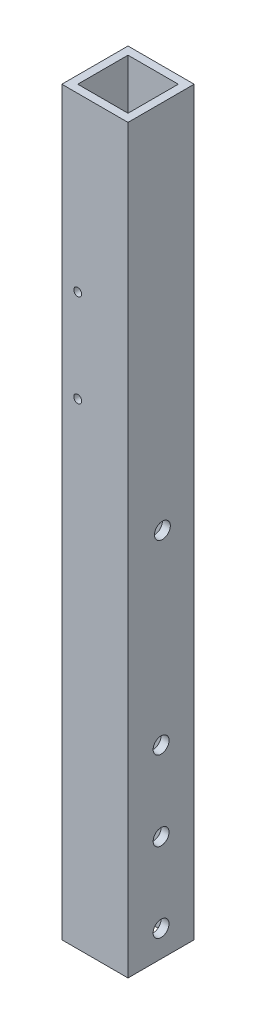
ISO-10303-21;
HEADER;
FILE_DESCRIPTION(('STEP AP214'),'2;1');
FILE_NAME('part.step','',(''),(''),'','','');
FILE_SCHEMA(('AUTOMOTIVE_DESIGN { 1 0 10303 214 1 1 1 1 }'));
ENDSEC;
DATA;
#1=APPLICATION_CONTEXT('core data for automotive mechanical design processes');
#2=APPLICATION_PROTOCOL_DEFINITION('international standard','automotive_design',2000,#1);
#3=PRODUCT_CONTEXT('',#1,'mechanical');
#4=PRODUCT('Part','Part','',(#3));
#5=PRODUCT_RELATED_PRODUCT_CATEGORY('part','',(#4));
#6=PRODUCT_DEFINITION_FORMATION('','',#4);
#7=PRODUCT_DEFINITION_CONTEXT('part definition',#1,'design');
#8=PRODUCT_DEFINITION('design','',#6,#7);
#9=PRODUCT_DEFINITION_SHAPE('','',#8);
#10=(LENGTH_UNIT() NAMED_UNIT(*) SI_UNIT(.MILLI.,.METRE.));
#11=(NAMED_UNIT(*) PLANE_ANGLE_UNIT() SI_UNIT($,.RADIAN.));
#12=(NAMED_UNIT(*) SI_UNIT($,.STERADIAN.) SOLID_ANGLE_UNIT());
#13=UNCERTAINTY_MEASURE_WITH_UNIT(LENGTH_MEASURE(1.E-05),#10,'distance_accuracy_value','');
#14=(GEOMETRIC_REPRESENTATION_CONTEXT(3) GLOBAL_UNCERTAINTY_ASSIGNED_CONTEXT((#13)) GLOBAL_UNIT_ASSIGNED_CONTEXT((#10,
#11,#12)) REPRESENTATION_CONTEXT('',''));
#15=CARTESIAN_POINT('',(0.,0.,0.));
#16=DIRECTION('',(0.,0.,1.));
#17=DIRECTION('',(1.,0.,0.));
#18=AXIS2_PLACEMENT_3D('',#15,#16,#17);
#19=CARTESIAN_POINT('',(0.,280.,0.));
#20=DIRECTION('',(0.,-1.,0.));
#21=DIRECTION('',(0.,0.,-1.));
#22=AXIS2_PLACEMENT_3D('',#19,#20,#21);
#23=PLANE('',#22);
#24=DIRECTION('',(0.,0.,1.));
#25=VECTOR('',#24,1.);
#26=CARTESIAN_POINT('',(0.,280.,0.));
#27=LINE('',#26,#25);
#28=CARTESIAN_POINT('',(0.,280.,-25.));
#29=VERTEX_POINT('',#28);
#30=CARTESIAN_POINT('',(0.,280.,0.));
#31=VERTEX_POINT('',#30);
#32=EDGE_CURVE('E140',#29,#31,#27,.T.);
#33=ORIENTED_EDGE('',*,*,#32,.T.);
#34=DIRECTION('',(1.,0.,0.));
#35=VECTOR('',#34,1.);
#36=CARTESIAN_POINT('',(0.,280.,0.));
#37=LINE('',#36,#35);
#38=CARTESIAN_POINT('',(25.,280.,0.));
#39=VERTEX_POINT('',#38);
#40=EDGE_CURVE('E143',#31,#39,#37,.T.);
#41=ORIENTED_EDGE('',*,*,#40,.T.);
#42=DIRECTION('',(0.,0.,-1.));
#43=VECTOR('',#42,1.);
#44=CARTESIAN_POINT('',(25.,280.,0.));
#45=LINE('',#44,#43);
#46=CARTESIAN_POINT('',(25.,280.,-25.));
#47=VERTEX_POINT('',#46);
#48=EDGE_CURVE('E146',#39,#47,#45,.T.);
#49=ORIENTED_EDGE('',*,*,#48,.T.);
#50=DIRECTION('',(-1.,0.,0.));
#51=VECTOR('',#50,1.);
#52=CARTESIAN_POINT('',(0.,280.,-25.));
#53=LINE('',#52,#51);
#54=EDGE_CURVE('E148',#47,#29,#53,.T.);
#55=ORIENTED_EDGE('',*,*,#54,.T.);
#56=EDGE_LOOP('',(#33,#41,#49,#55));
#57=FACE_BOUND('',#56,.T.);
#58=DIRECTION('',(0.,0.,1.));
#59=VECTOR('',#58,1.);
#60=CARTESIAN_POINT('',(3.,280.,-3.));
#61=LINE('',#60,#59);
#62=CARTESIAN_POINT('',(3.,280.,-22.));
#63=VERTEX_POINT('',#62);
#64=CARTESIAN_POINT('',(3.,280.,-3.));
#65=VERTEX_POINT('',#64);
#66=EDGE_CURVE('E102',#63,#65,#61,.T.);
#67=ORIENTED_EDGE('',*,*,#66,.F.);
#68=DIRECTION('',(-1.,0.,0.));
#69=VECTOR('',#68,1.);
#70=CARTESIAN_POINT('',(3.,280.,-22.));
#71=LINE('',#70,#69);
#72=CARTESIAN_POINT('',(22.,280.,-22.));
#73=VERTEX_POINT('',#72);
#74=EDGE_CURVE('E124',#73,#63,#71,.T.);
#75=ORIENTED_EDGE('',*,*,#74,.F.);
#76=DIRECTION('',(0.,0.,-1.));
#77=VECTOR('',#76,1.);
#78=CARTESIAN_POINT('',(22.,280.,-3.));
#79=LINE('',#78,#77);
#80=CARTESIAN_POINT('',(22.,280.,-3.));
#81=VERTEX_POINT('',#80);
#82=EDGE_CURVE('E122',#81,#73,#79,.T.);
#83=ORIENTED_EDGE('',*,*,#82,.F.);
#84=DIRECTION('',(1.,0.,0.));
#85=VECTOR('',#84,1.);
#86=CARTESIAN_POINT('',(3.,280.,-3.));
#87=LINE('',#86,#85);
#88=EDGE_CURVE('E110',#65,#81,#87,.T.);
#89=ORIENTED_EDGE('',*,*,#88,.F.);
#90=EDGE_LOOP('',(#67,#75,#83,#89));
#91=FACE_BOUND('',#90,.T.);
#92=ADVANCED_FACE('F35',(#57,#91),#23,.F.);
#93=CARTESIAN_POINT('',(0.,0.,0.));
#94=DIRECTION('',(0.,-1.,0.));
#95=DIRECTION('',(0.,0.,-1.));
#96=AXIS2_PLACEMENT_3D('',#93,#94,#95);
#97=PLANE('',#96);
#98=DIRECTION('',(0.,0.,1.));
#99=VECTOR('',#98,1.);
#100=CARTESIAN_POINT('',(0.,0.,0.));
#101=LINE('',#100,#99);
#102=CARTESIAN_POINT('',(0.,0.,-25.));
#103=VERTEX_POINT('',#102);
#104=CARTESIAN_POINT('',(0.,0.,0.));
#105=VERTEX_POINT('',#104);
#106=EDGE_CURVE('E118',#103,#105,#101,.T.);
#107=ORIENTED_EDGE('',*,*,#106,.F.);
#108=DIRECTION('',(-1.,0.,0.));
#109=VECTOR('',#108,1.);
#110=CARTESIAN_POINT('',(0.,0.,-25.));
#111=LINE('',#110,#109);
#112=CARTESIAN_POINT('',(25.,0.,-25.));
#113=VERTEX_POINT('',#112);
#114=EDGE_CURVE('E144',#113,#103,#111,.T.);
#115=ORIENTED_EDGE('',*,*,#114,.F.);
#116=DIRECTION('',(0.,0.,-1.));
#117=VECTOR('',#116,1.);
#118=CARTESIAN_POINT('',(25.,0.,0.));
#119=LINE('',#118,#117);
#120=CARTESIAN_POINT('',(25.,0.,0.));
#121=VERTEX_POINT('',#120);
#122=EDGE_CURVE('E155',#121,#113,#119,.T.);
#123=ORIENTED_EDGE('',*,*,#122,.F.);
#124=DIRECTION('',(1.,0.,0.));
#125=VECTOR('',#124,1.);
#126=CARTESIAN_POINT('',(0.,0.,0.));
#127=LINE('',#126,#125);
#128=EDGE_CURVE('E153',#105,#121,#127,.T.);
#129=ORIENTED_EDGE('',*,*,#128,.F.);
#130=EDGE_LOOP('',(#107,#115,#123,#129));
#131=FACE_BOUND('',#130,.T.);
#132=DIRECTION('',(-1.,0.,0.));
#133=VECTOR('',#132,1.);
#134=CARTESIAN_POINT('',(3.,0.,-22.));
#135=LINE('',#134,#133);
#136=CARTESIAN_POINT('',(22.,0.,-22.));
#137=VERTEX_POINT('',#136);
#138=CARTESIAN_POINT('',(3.,0.,-22.));
#139=VERTEX_POINT('',#138);
#140=EDGE_CURVE('E111',#137,#139,#135,.T.);
#141=ORIENTED_EDGE('',*,*,#140,.T.);
#142=DIRECTION('',(0.,0.,1.));
#143=VECTOR('',#142,1.);
#144=CARTESIAN_POINT('',(3.,0.,-3.));
#145=LINE('',#144,#143);
#146=CARTESIAN_POINT('',(3.,0.,-3.));
#147=VERTEX_POINT('',#146);
#148=EDGE_CURVE('E60',#139,#147,#145,.T.);
#149=ORIENTED_EDGE('',*,*,#148,.T.);
#150=DIRECTION('',(1.,0.,0.));
#151=VECTOR('',#150,1.);
#152=CARTESIAN_POINT('',(3.,0.,-3.));
#153=LINE('',#152,#151);
#154=CARTESIAN_POINT('',(22.,0.,-3.));
#155=VERTEX_POINT('',#154);
#156=EDGE_CURVE('E117',#147,#155,#153,.T.);
#157=ORIENTED_EDGE('',*,*,#156,.T.);
#158=DIRECTION('',(0.,0.,-1.));
#159=VECTOR('',#158,1.);
#160=CARTESIAN_POINT('',(22.,0.,-3.));
#161=LINE('',#160,#159);
#162=EDGE_CURVE('E132',#155,#137,#161,.T.);
#163=ORIENTED_EDGE('',*,*,#162,.T.);
#164=EDGE_LOOP('',(#141,#149,#157,#163));
#165=FACE_BOUND('',#164,.T.);
#166=ADVANCED_FACE('F250',(#131,#165),#97,.T.);
#167=CARTESIAN_POINT('',(0.,280.,0.));
#168=DIRECTION('',(1.,0.,0.));
#169=DIRECTION('',(0.,0.,-1.));
#170=AXIS2_PLACEMENT_3D('',#167,#168,#169);
#171=PLANE('',#170);
#172=CARTESIAN_POINT('',(0.,10.,-12.5));
#173=DIRECTION('',(1.,0.,0.));
#174=DIRECTION('',(0.,0.,-1.));
#175=AXIS2_PLACEMENT_3D('',#172,#173,#174);
#176=CIRCLE('',#175,3.);
#177=CARTESIAN_POINT('',(0.,10.,-15.5));
#178=VERTEX_POINT('',#177);
#179=EDGE_CURVE('E208',#178,#178,#176,.T.);
#180=ORIENTED_EDGE('',*,*,#179,.T.);
#181=EDGE_LOOP('',(#180));
#182=FACE_BOUND('',#181,.T.);
#183=CARTESIAN_POINT('',(0.,40.,-12.4999999999999));
#184=DIRECTION('',(1.,0.,0.));
#185=DIRECTION('',(0.,0.,-1.));
#186=AXIS2_PLACEMENT_3D('',#183,#184,#185);
#187=CIRCLE('',#186,3.);
#188=CARTESIAN_POINT('',(0.,40.,-15.4999999999999));
#189=VERTEX_POINT('',#188);
#190=EDGE_CURVE('E214',#189,#189,#187,.T.);
#191=ORIENTED_EDGE('',*,*,#190,.T.);
#192=EDGE_LOOP('',(#191));
#193=FACE_BOUND('',#192,.T.);
#194=CARTESIAN_POINT('',(0.,70.,-12.4999999999998));
#195=DIRECTION('',(1.,0.,0.));
#196=DIRECTION('',(0.,0.,-1.));
#197=AXIS2_PLACEMENT_3D('',#194,#195,#196);
#198=CIRCLE('',#197,3.);
#199=CARTESIAN_POINT('',(0.,70.,-15.4999999999998));
#200=VERTEX_POINT('',#199);
#201=EDGE_CURVE('E220',#200,#200,#198,.T.);
#202=ORIENTED_EDGE('',*,*,#201,.T.);
#203=EDGE_LOOP('',(#202));
#204=FACE_BOUND('',#203,.T.);
#205=CARTESIAN_POINT('',(0.,140.,-13.));
#206=DIRECTION('',(1.,0.,0.));
#207=DIRECTION('',(0.,0.,-1.));
#208=AXIS2_PLACEMENT_3D('',#205,#206,#207);
#209=CIRCLE('',#208,3.);
#210=CARTESIAN_POINT('',(0.,140.,-16.));
#211=VERTEX_POINT('',#210);
#212=EDGE_CURVE('E205',#211,#211,#209,.T.);
#213=ORIENTED_EDGE('',*,*,#212,.T.);
#214=EDGE_LOOP('',(#213));
#215=FACE_BOUND('',#214,.T.);
#216=ORIENTED_EDGE('',*,*,#106,.T.);
#217=DIRECTION('',(0.,-1.,0.));
#218=VECTOR('',#217,1.);
#219=CARTESIAN_POINT('',(0.,280.,0.));
#220=LINE('',#219,#218);
#221=EDGE_CURVE('E11',#31,#105,#220,.T.);
#222=ORIENTED_EDGE('',*,*,#221,.F.);
#223=ORIENTED_EDGE('',*,*,#32,.F.);
#224=DIRECTION('',(0.,-1.,0.));
#225=VECTOR('',#224,1.);
#226=CARTESIAN_POINT('',(0.,280.,-25.));
#227=LINE('',#226,#225);
#228=EDGE_CURVE('E150',#29,#103,#227,.T.);
#229=ORIENTED_EDGE('',*,*,#228,.T.);
#230=EDGE_LOOP('',(#216,#222,#223,#229));
#231=FACE_BOUND('',#230,.T.);
#232=ADVANCED_FACE('F37',(#182,#193,#204,#215,#231),#171,.F.);
#233=CARTESIAN_POINT('',(0.,280.,0.));
#234=DIRECTION('',(0.,0.,-1.));
#235=DIRECTION('',(-1.,0.,0.));
#236=AXIS2_PLACEMENT_3D('',#233,#234,#235);
#237=PLANE('',#236);
#238=CARTESIAN_POINT('',(6.,180.,0.));
#239=DIRECTION('',(0.,0.,1.));
#240=DIRECTION('',(1.,0.,0.));
#241=AXIS2_PLACEMENT_3D('',#238,#239,#240);
#242=CIRCLE('',#241,1.5);
#243=CARTESIAN_POINT('',(7.5,180.,0.));
#244=VERTEX_POINT('',#243);
#245=EDGE_CURVE('E189',#244,#244,#242,.T.);
#246=ORIENTED_EDGE('',*,*,#245,.F.);
#247=EDGE_LOOP('',(#246));
#248=FACE_BOUND('',#247,.T.);
#249=CARTESIAN_POINT('',(5.99999999999988,215.,0.));
#250=DIRECTION('',(0.,0.,1.));
#251=DIRECTION('',(1.,0.,0.));
#252=AXIS2_PLACEMENT_3D('',#249,#250,#251);
#253=CIRCLE('',#252,1.5);
#254=CARTESIAN_POINT('',(7.49999999999988,215.,0.));
#255=VERTEX_POINT('',#254);
#256=EDGE_CURVE('E199',#255,#255,#253,.T.);
#257=ORIENTED_EDGE('',*,*,#256,.F.);
#258=EDGE_LOOP('',(#257));
#259=FACE_BOUND('',#258,.T.);
#260=ORIENTED_EDGE('',*,*,#128,.T.);
#261=DIRECTION('',(0.,-1.,0.));
#262=VECTOR('',#261,1.);
#263=CARTESIAN_POINT('',(25.,280.,0.));
#264=LINE('',#263,#262);
#265=EDGE_CURVE('E44',#39,#121,#264,.T.);
#266=ORIENTED_EDGE('',*,*,#265,.F.);
#267=ORIENTED_EDGE('',*,*,#40,.F.);
#268=ORIENTED_EDGE('',*,*,#221,.T.);
#269=EDGE_LOOP('',(#260,#266,#267,#268));
#270=FACE_BOUND('',#269,.T.);
#271=ADVANCED_FACE('F249',(#248,#259,#270),#237,.F.);
#272=CARTESIAN_POINT('',(25.,280.,0.));
#273=DIRECTION('',(-1.,0.,0.));
#274=DIRECTION('',(0.,0.,1.));
#275=AXIS2_PLACEMENT_3D('',#272,#273,#274);
#276=PLANE('',#275);
#277=CARTESIAN_POINT('',(25.,10.,-12.5));
#278=DIRECTION('',(1.,0.,0.));
#279=DIRECTION('',(0.,0.,-1.));
#280=AXIS2_PLACEMENT_3D('',#277,#278,#279);
#281=CIRCLE('',#280,3.);
#282=CARTESIAN_POINT('',(25.,10.,-15.5));
#283=VERTEX_POINT('',#282);
#284=EDGE_CURVE('E169',#283,#283,#281,.T.);
#285=ORIENTED_EDGE('',*,*,#284,.F.);
#286=EDGE_LOOP('',(#285));
#287=FACE_BOUND('',#286,.T.);
#288=CARTESIAN_POINT('',(25.,40.,-12.4999999999999));
#289=DIRECTION('',(1.,0.,0.));
#290=DIRECTION('',(0.,0.,-1.));
#291=AXIS2_PLACEMENT_3D('',#288,#289,#290);
#292=CIRCLE('',#291,3.);
#293=CARTESIAN_POINT('',(25.,40.,-15.4999999999999));
#294=VERTEX_POINT('',#293);
#295=EDGE_CURVE('E211',#294,#294,#292,.T.);
#296=ORIENTED_EDGE('',*,*,#295,.F.);
#297=EDGE_LOOP('',(#296));
#298=FACE_BOUND('',#297,.T.);
#299=CARTESIAN_POINT('',(25.,70.,-12.4999999999998));
#300=DIRECTION('',(1.,0.,0.));
#301=DIRECTION('',(0.,0.,-1.));
#302=AXIS2_PLACEMENT_3D('',#299,#300,#301);
#303=CIRCLE('',#302,3.);
#304=CARTESIAN_POINT('',(25.,70.,-15.4999999999998));
#305=VERTEX_POINT('',#304);
#306=EDGE_CURVE('E217',#305,#305,#303,.T.);
#307=ORIENTED_EDGE('',*,*,#306,.F.);
#308=EDGE_LOOP('',(#307));
#309=FACE_BOUND('',#308,.T.);
#310=CARTESIAN_POINT('',(25.,140.,-13.));
#311=DIRECTION('',(1.,0.,0.));
#312=DIRECTION('',(0.,0.,-1.));
#313=AXIS2_PLACEMENT_3D('',#310,#311,#312);
#314=CIRCLE('',#313,3.);
#315=CARTESIAN_POINT('',(25.,140.,-16.));
#316=VERTEX_POINT('',#315);
#317=EDGE_CURVE('E223',#316,#316,#314,.T.);
#318=ORIENTED_EDGE('',*,*,#317,.F.);
#319=EDGE_LOOP('',(#318));
#320=FACE_BOUND('',#319,.T.);
#321=ORIENTED_EDGE('',*,*,#122,.T.);
#322=DIRECTION('',(0.,-1.,0.));
#323=VECTOR('',#322,1.);
#324=CARTESIAN_POINT('',(25.,280.,-25.));
#325=LINE('',#324,#323);
#326=EDGE_CURVE('E160',#47,#113,#325,.T.);
#327=ORIENTED_EDGE('',*,*,#326,.F.);
#328=ORIENTED_EDGE('',*,*,#48,.F.);
#329=ORIENTED_EDGE('',*,*,#265,.T.);
#330=EDGE_LOOP('',(#321,#327,#328,#329));
#331=FACE_BOUND('',#330,.T.);
#332=ADVANCED_FACE('F274',(#287,#298,#309,#320,#331),#276,.F.);
#333=CARTESIAN_POINT('',(0.,280.,-25.));
#334=DIRECTION('',(0.,0.,1.));
#335=DIRECTION('',(1.,0.,0.));
#336=AXIS2_PLACEMENT_3D('',#333,#334,#335);
#337=PLANE('',#336);
#338=CARTESIAN_POINT('',(6.,180.,-25.));
#339=DIRECTION('',(0.,0.,1.));
#340=DIRECTION('',(1.,0.,0.));
#341=AXIS2_PLACEMENT_3D('',#338,#339,#340);
#342=CIRCLE('',#341,1.5);
#343=CARTESIAN_POINT('',(7.5,180.,-25.));
#344=VERTEX_POINT('',#343);
#345=EDGE_CURVE('E183',#344,#344,#342,.T.);
#346=ORIENTED_EDGE('',*,*,#345,.T.);
#347=EDGE_LOOP('',(#346));
#348=FACE_BOUND('',#347,.T.);
#349=CARTESIAN_POINT('',(5.99999999999988,215.,-25.));
#350=DIRECTION('',(0.,0.,1.));
#351=DIRECTION('',(1.,0.,0.));
#352=AXIS2_PLACEMENT_3D('',#349,#350,#351);
#353=CIRCLE('',#352,1.5);
#354=CARTESIAN_POINT('',(7.49999999999988,215.,-25.));
#355=VERTEX_POINT('',#354);
#356=EDGE_CURVE('E194',#355,#355,#353,.T.);
#357=ORIENTED_EDGE('',*,*,#356,.T.);
#358=EDGE_LOOP('',(#357));
#359=FACE_BOUND('',#358,.T.);
#360=ORIENTED_EDGE('',*,*,#114,.T.);
#361=ORIENTED_EDGE('',*,*,#228,.F.);
#362=ORIENTED_EDGE('',*,*,#54,.F.);
#363=ORIENTED_EDGE('',*,*,#326,.T.);
#364=EDGE_LOOP('',(#360,#361,#362,#363));
#365=FACE_BOUND('',#364,.T.);
#366=ADVANCED_FACE('F272',(#348,#359,#365),#337,.F.);
#367=CARTESIAN_POINT('',(3.,280.,-3.));
#368=DIRECTION('',(1.,0.,0.));
#369=DIRECTION('',(0.,0.,-1.));
#370=AXIS2_PLACEMENT_3D('',#367,#368,#369);
#371=PLANE('',#370);
#372=CARTESIAN_POINT('',(3.,10.,-12.5));
#373=DIRECTION('',(1.,0.,0.));
#374=DIRECTION('',(0.,0.,-1.));
#375=AXIS2_PLACEMENT_3D('',#372,#373,#374);
#376=CIRCLE('',#375,3.);
#377=CARTESIAN_POINT('',(3.,10.,-15.5));
#378=VERTEX_POINT('',#377);
#379=EDGE_CURVE('E130',#378,#378,#376,.F.);
#380=ORIENTED_EDGE('',*,*,#379,.T.);
#381=EDGE_LOOP('',(#380));
#382=FACE_BOUND('',#381,.T.);
#383=CARTESIAN_POINT('',(3.,40.,-12.4999999999999));
#384=DIRECTION('',(1.,0.,0.));
#385=DIRECTION('',(0.,0.,-1.));
#386=AXIS2_PLACEMENT_3D('',#383,#384,#385);
#387=CIRCLE('',#386,3.);
#388=CARTESIAN_POINT('',(3.,40.,-15.4999999999999));
#389=VERTEX_POINT('',#388);
#390=EDGE_CURVE('E177',#389,#389,#387,.F.);
#391=ORIENTED_EDGE('',*,*,#390,.T.);
#392=EDGE_LOOP('',(#391));
#393=FACE_BOUND('',#392,.T.);
#394=CARTESIAN_POINT('',(3.,70.,-12.4999999999998));
#395=DIRECTION('',(1.,0.,0.));
#396=DIRECTION('',(0.,0.,-1.));
#397=AXIS2_PLACEMENT_3D('',#394,#395,#396);
#398=CIRCLE('',#397,3.);
#399=CARTESIAN_POINT('',(3.,70.,-15.4999999999998));
#400=VERTEX_POINT('',#399);
#401=EDGE_CURVE('E173',#400,#400,#398,.F.);
#402=ORIENTED_EDGE('',*,*,#401,.T.);
#403=EDGE_LOOP('',(#402));
#404=FACE_BOUND('',#403,.T.);
#405=CARTESIAN_POINT('',(3.,140.,-13.));
#406=DIRECTION('',(1.,0.,0.));
#407=DIRECTION('',(0.,0.,-1.));
#408=AXIS2_PLACEMENT_3D('',#405,#406,#407);
#409=CIRCLE('',#408,3.);
#410=CARTESIAN_POINT('',(3.,140.,-16.));
#411=VERTEX_POINT('',#410);
#412=EDGE_CURVE('E168',#411,#411,#409,.F.);
#413=ORIENTED_EDGE('',*,*,#412,.T.);
#414=EDGE_LOOP('',(#413));
#415=FACE_BOUND('',#414,.T.);
#416=ORIENTED_EDGE('',*,*,#148,.F.);
#417=DIRECTION('',(0.,-1.,0.));
#418=VECTOR('',#417,1.);
#419=CARTESIAN_POINT('',(3.,280.,-22.));
#420=LINE('',#419,#418);
#421=EDGE_CURVE('E106',#63,#139,#420,.T.);
#422=ORIENTED_EDGE('',*,*,#421,.F.);
#423=ORIENTED_EDGE('',*,*,#66,.T.);
#424=DIRECTION('',(0.,-1.,0.));
#425=VECTOR('',#424,1.);
#426=CARTESIAN_POINT('',(3.,280.,-3.));
#427=LINE('',#426,#425);
#428=EDGE_CURVE('E105',#65,#147,#427,.T.);
#429=ORIENTED_EDGE('',*,*,#428,.T.);
#430=EDGE_LOOP('',(#416,#422,#423,#429));
#431=FACE_BOUND('',#430,.T.);
#432=ADVANCED_FACE('F104',(#382,#393,#404,#415,#431),#371,.T.);
#433=CARTESIAN_POINT('',(3.,280.,-3.));
#434=DIRECTION('',(0.,0.,-1.));
#435=DIRECTION('',(-1.,0.,0.));
#436=AXIS2_PLACEMENT_3D('',#433,#434,#435);
#437=PLANE('',#436);
#438=CARTESIAN_POINT('',(6.,180.,-3.));
#439=DIRECTION('',(0.,0.,-1.));
#440=DIRECTION('',(-1.,0.,0.));
#441=AXIS2_PLACEMENT_3D('',#438,#439,#440);
#442=CIRCLE('',#441,1.5);
#443=CARTESIAN_POINT('',(4.5,180.,-3.));
#444=VERTEX_POINT('',#443);
#445=EDGE_CURVE('E202',#444,#444,#442,.T.);
#446=ORIENTED_EDGE('',*,*,#445,.F.);
#447=EDGE_LOOP('',(#446));
#448=FACE_BOUND('',#447,.T.);
#449=CARTESIAN_POINT('',(5.99999999999988,215.,-3.));
#450=DIRECTION('',(0.,0.,-1.));
#451=DIRECTION('',(-1.,0.,0.));
#452=AXIS2_PLACEMENT_3D('',#449,#450,#451);
#453=CIRCLE('',#452,1.5);
#454=CARTESIAN_POINT('',(4.49999999999988,215.,-3.));
#455=VERTEX_POINT('',#454);
#456=EDGE_CURVE('E182',#455,#455,#453,.T.);
#457=ORIENTED_EDGE('',*,*,#456,.F.);
#458=EDGE_LOOP('',(#457));
#459=FACE_BOUND('',#458,.T.);
#460=ORIENTED_EDGE('',*,*,#156,.F.);
#461=ORIENTED_EDGE('',*,*,#428,.F.);
#462=ORIENTED_EDGE('',*,*,#88,.T.);
#463=DIRECTION('',(0.,-1.,0.));
#464=VECTOR('',#463,1.);
#465=CARTESIAN_POINT('',(22.,280.,-3.));
#466=LINE('',#465,#464);
#467=EDGE_CURVE('E119',#81,#155,#466,.T.);
#468=ORIENTED_EDGE('',*,*,#467,.T.);
#469=EDGE_LOOP('',(#460,#461,#462,#468));
#470=FACE_BOUND('',#469,.T.);
#471=ADVANCED_FACE('F114',(#448,#459,#470),#437,.T.);
#472=CARTESIAN_POINT('',(22.,280.,-3.));
#473=DIRECTION('',(-1.,0.,0.));
#474=DIRECTION('',(0.,0.,1.));
#475=AXIS2_PLACEMENT_3D('',#472,#473,#474);
#476=PLANE('',#475);
#477=CARTESIAN_POINT('',(22.,10.,-12.5));
#478=DIRECTION('',(-1.,0.,0.));
#479=DIRECTION('',(0.,0.,1.));
#480=AXIS2_PLACEMENT_3D('',#477,#478,#479);
#481=CIRCLE('',#480,3.);
#482=CARTESIAN_POINT('',(22.,10.,-9.5));
#483=VERTEX_POINT('',#482);
#484=EDGE_CURVE('E178',#483,#483,#481,.F.);
#485=ORIENTED_EDGE('',*,*,#484,.T.);
#486=EDGE_LOOP('',(#485));
#487=FACE_BOUND('',#486,.T.);
#488=CARTESIAN_POINT('',(22.,40.,-12.4999999999999));
#489=DIRECTION('',(-1.,0.,0.));
#490=DIRECTION('',(0.,0.,1.));
#491=AXIS2_PLACEMENT_3D('',#488,#489,#490);
#492=CIRCLE('',#491,3.);
#493=CARTESIAN_POINT('',(22.,40.,-9.4999999999999));
#494=VERTEX_POINT('',#493);
#495=EDGE_CURVE('E174',#494,#494,#492,.F.);
#496=ORIENTED_EDGE('',*,*,#495,.T.);
#497=EDGE_LOOP('',(#496));
#498=FACE_BOUND('',#497,.T.);
#499=CARTESIAN_POINT('',(22.,70.,-12.4999999999998));
#500=DIRECTION('',(-1.,0.,0.));
#501=DIRECTION('',(0.,0.,1.));
#502=AXIS2_PLACEMENT_3D('',#499,#500,#501);
#503=CIRCLE('',#502,3.);
#504=CARTESIAN_POINT('',(22.,70.,-9.49999999999979));
#505=VERTEX_POINT('',#504);
#506=EDGE_CURVE('E170',#505,#505,#503,.F.);
#507=ORIENTED_EDGE('',*,*,#506,.T.);
#508=EDGE_LOOP('',(#507));
#509=FACE_BOUND('',#508,.T.);
#510=CARTESIAN_POINT('',(22.,140.,-13.));
#511=DIRECTION('',(-1.,0.,0.));
#512=DIRECTION('',(0.,0.,1.));
#513=AXIS2_PLACEMENT_3D('',#510,#511,#512);
#514=CIRCLE('',#513,3.);
#515=CARTESIAN_POINT('',(22.,140.,-10.));
#516=VERTEX_POINT('',#515);
#517=EDGE_CURVE('E165',#516,#516,#514,.F.);
#518=ORIENTED_EDGE('',*,*,#517,.T.);
#519=EDGE_LOOP('',(#518));
#520=FACE_BOUND('',#519,.T.);
#521=ORIENTED_EDGE('',*,*,#162,.F.);
#522=ORIENTED_EDGE('',*,*,#467,.F.);
#523=ORIENTED_EDGE('',*,*,#82,.T.);
#524=DIRECTION('',(0.,-1.,0.));
#525=VECTOR('',#524,1.);
#526=CARTESIAN_POINT('',(22.,280.,-22.));
#527=LINE('',#526,#525);
#528=EDGE_CURVE('E52',#73,#137,#527,.T.);
#529=ORIENTED_EDGE('',*,*,#528,.T.);
#530=EDGE_LOOP('',(#521,#522,#523,#529));
#531=FACE_BOUND('',#530,.T.);
#532=ADVANCED_FACE('F297',(#487,#498,#509,#520,#531),#476,.T.);
#533=CARTESIAN_POINT('',(3.,280.,-22.));
#534=DIRECTION('',(0.,0.,1.));
#535=DIRECTION('',(1.,0.,0.));
#536=AXIS2_PLACEMENT_3D('',#533,#534,#535);
#537=PLANE('',#536);
#538=CARTESIAN_POINT('',(6.,180.,-22.));
#539=DIRECTION('',(0.,0.,1.));
#540=DIRECTION('',(1.,0.,0.));
#541=AXIS2_PLACEMENT_3D('',#538,#539,#540);
#542=CIRCLE('',#541,1.5);
#543=CARTESIAN_POINT('',(7.5,180.,-22.));
#544=VERTEX_POINT('',#543);
#545=EDGE_CURVE('E39',#544,#544,#542,.T.);
#546=ORIENTED_EDGE('',*,*,#545,.F.);
#547=EDGE_LOOP('',(#546));
#548=FACE_BOUND('',#547,.T.);
#549=CARTESIAN_POINT('',(5.99999999999988,215.,-22.));
#550=DIRECTION('',(0.,0.,1.));
#551=DIRECTION('',(1.,0.,0.));
#552=AXIS2_PLACEMENT_3D('',#549,#550,#551);
#553=CIRCLE('',#552,1.5);
#554=CARTESIAN_POINT('',(7.49999999999988,215.,-22.));
#555=VERTEX_POINT('',#554);
#556=EDGE_CURVE('E180',#555,#555,#553,.T.);
#557=ORIENTED_EDGE('',*,*,#556,.F.);
#558=EDGE_LOOP('',(#557));
#559=FACE_BOUND('',#558,.T.);
#560=ORIENTED_EDGE('',*,*,#140,.F.);
#561=ORIENTED_EDGE('',*,*,#528,.F.);
#562=ORIENTED_EDGE('',*,*,#74,.T.);
#563=ORIENTED_EDGE('',*,*,#421,.T.);
#564=EDGE_LOOP('',(#560,#561,#562,#563));
#565=FACE_BOUND('',#564,.T.);
#566=ADVANCED_FACE('F301',(#548,#559,#565),#537,.T.);
#567=CARTESIAN_POINT('',(25.,140.,-13.));
#568=DIRECTION('',(-1.,0.,0.));
#569=DIRECTION('',(0.,0.,1.));
#570=AXIS2_PLACEMENT_3D('',#567,#568,#569);
#571=CYLINDRICAL_SURFACE('',#570,3.);
#572=ORIENTED_EDGE('',*,*,#517,.F.);
#573=EDGE_LOOP('',(#572));
#574=FACE_BOUND('',#573,.T.);
#575=ORIENTED_EDGE('',*,*,#317,.T.);
#576=EDGE_LOOP('',(#575));
#577=FACE_BOUND('',#576,.T.);
#578=ADVANCED_FACE('F305',(#574,#577),#571,.F.);
#579=CARTESIAN_POINT('',(25.,70.,-12.4999999999998));
#580=DIRECTION('',(-1.,0.,0.));
#581=DIRECTION('',(0.,0.,1.));
#582=AXIS2_PLACEMENT_3D('',#579,#580,#581);
#583=CYLINDRICAL_SURFACE('',#582,3.);
#584=ORIENTED_EDGE('',*,*,#506,.F.);
#585=EDGE_LOOP('',(#584));
#586=FACE_BOUND('',#585,.T.);
#587=ORIENTED_EDGE('',*,*,#306,.T.);
#588=EDGE_LOOP('',(#587));
#589=FACE_BOUND('',#588,.T.);
#590=ADVANCED_FACE('F309',(#586,#589),#583,.F.);
#591=CARTESIAN_POINT('',(25.,40.,-12.4999999999999));
#592=DIRECTION('',(-1.,0.,0.));
#593=DIRECTION('',(0.,0.,1.));
#594=AXIS2_PLACEMENT_3D('',#591,#592,#593);
#595=CYLINDRICAL_SURFACE('',#594,3.);
#596=ORIENTED_EDGE('',*,*,#495,.F.);
#597=EDGE_LOOP('',(#596));
#598=FACE_BOUND('',#597,.T.);
#599=ORIENTED_EDGE('',*,*,#295,.T.);
#600=EDGE_LOOP('',(#599));
#601=FACE_BOUND('',#600,.T.);
#602=ADVANCED_FACE('F314',(#598,#601),#595,.F.);
#603=CARTESIAN_POINT('',(25.,10.,-12.5));
#604=DIRECTION('',(-1.,0.,0.));
#605=DIRECTION('',(0.,0.,1.));
#606=AXIS2_PLACEMENT_3D('',#603,#604,#605);
#607=CYLINDRICAL_SURFACE('',#606,3.);
#608=ORIENTED_EDGE('',*,*,#484,.F.);
#609=EDGE_LOOP('',(#608));
#610=FACE_BOUND('',#609,.T.);
#611=ORIENTED_EDGE('',*,*,#284,.T.);
#612=EDGE_LOOP('',(#611));
#613=FACE_BOUND('',#612,.T.);
#614=ADVANCED_FACE('F244',(#610,#613),#607,.F.);
#615=ORIENTED_EDGE('',*,*,#412,.F.);
#616=EDGE_LOOP('',(#615));
#617=FACE_BOUND('',#616,.T.);
#618=ORIENTED_EDGE('',*,*,#212,.F.);
#619=EDGE_LOOP('',(#618));
#620=FACE_BOUND('',#619,.T.);
#621=ADVANCED_FACE('F311',(#617,#620),#571,.F.);
#622=ORIENTED_EDGE('',*,*,#401,.F.);
#623=EDGE_LOOP('',(#622));
#624=FACE_BOUND('',#623,.T.);
#625=ORIENTED_EDGE('',*,*,#201,.F.);
#626=EDGE_LOOP('',(#625));
#627=FACE_BOUND('',#626,.T.);
#628=ADVANCED_FACE('F316',(#624,#627),#583,.F.);
#629=ORIENTED_EDGE('',*,*,#390,.F.);
#630=EDGE_LOOP('',(#629));
#631=FACE_BOUND('',#630,.T.);
#632=ORIENTED_EDGE('',*,*,#190,.F.);
#633=EDGE_LOOP('',(#632));
#634=FACE_BOUND('',#633,.T.);
#635=ADVANCED_FACE('F242',(#631,#634),#595,.F.);
#636=ORIENTED_EDGE('',*,*,#379,.F.);
#637=EDGE_LOOP('',(#636));
#638=FACE_BOUND('',#637,.T.);
#639=ORIENTED_EDGE('',*,*,#179,.F.);
#640=EDGE_LOOP('',(#639));
#641=FACE_BOUND('',#640,.T.);
#642=ADVANCED_FACE('F238',(#638,#641),#607,.F.);
#643=CARTESIAN_POINT('',(5.99999999999988,215.,-25.));
#644=DIRECTION('',(0.,0.,1.));
#645=DIRECTION('',(1.,0.,0.));
#646=AXIS2_PLACEMENT_3D('',#643,#644,#645);
#647=CYLINDRICAL_SURFACE('',#646,1.5);
#648=ORIENTED_EDGE('',*,*,#556,.T.);
#649=EDGE_LOOP('',(#648));
#650=FACE_BOUND('',#649,.T.);
#651=ORIENTED_EDGE('',*,*,#356,.F.);
#652=EDGE_LOOP('',(#651));
#653=FACE_BOUND('',#652,.T.);
#654=ADVANCED_FACE('F241',(#650,#653),#647,.F.);
#655=CARTESIAN_POINT('',(6.,180.,-25.));
#656=DIRECTION('',(0.,0.,1.));
#657=DIRECTION('',(1.,0.,0.));
#658=AXIS2_PLACEMENT_3D('',#655,#656,#657);
#659=CYLINDRICAL_SURFACE('',#658,1.5);
#660=ORIENTED_EDGE('',*,*,#545,.T.);
#661=EDGE_LOOP('',(#660));
#662=FACE_BOUND('',#661,.T.);
#663=ORIENTED_EDGE('',*,*,#345,.F.);
#664=EDGE_LOOP('',(#663));
#665=FACE_BOUND('',#664,.T.);
#666=ADVANCED_FACE('F324',(#662,#665),#659,.F.);
#667=ORIENTED_EDGE('',*,*,#456,.T.);
#668=EDGE_LOOP('',(#667));
#669=FACE_BOUND('',#668,.T.);
#670=ORIENTED_EDGE('',*,*,#256,.T.);
#671=EDGE_LOOP('',(#670));
#672=FACE_BOUND('',#671,.T.);
#673=ADVANCED_FACE('F325',(#669,#672),#647,.F.);
#674=ORIENTED_EDGE('',*,*,#445,.T.);
#675=EDGE_LOOP('',(#674));
#676=FACE_BOUND('',#675,.T.);
#677=ORIENTED_EDGE('',*,*,#245,.T.);
#678=EDGE_LOOP('',(#677));
#679=FACE_BOUND('',#678,.T.);
#680=ADVANCED_FACE('F328',(#676,#679),#659,.F.);
#681=CLOSED_SHELL('',(#92,#166,#232,#271,#332,#366,#432,#471,#532,#566,#578,#590,#602,#614,#621,
#628,#635,#642,#654,#666,#673,#680));
#682=MANIFOLD_SOLID_BREP('B2',#681);
#683=ADVANCED_BREP_SHAPE_REPRESENTATION('',(#18,#682),#14);
#684=SHAPE_DEFINITION_REPRESENTATION(#9,#683);
ENDSEC;
END-ISO-10303-21;
